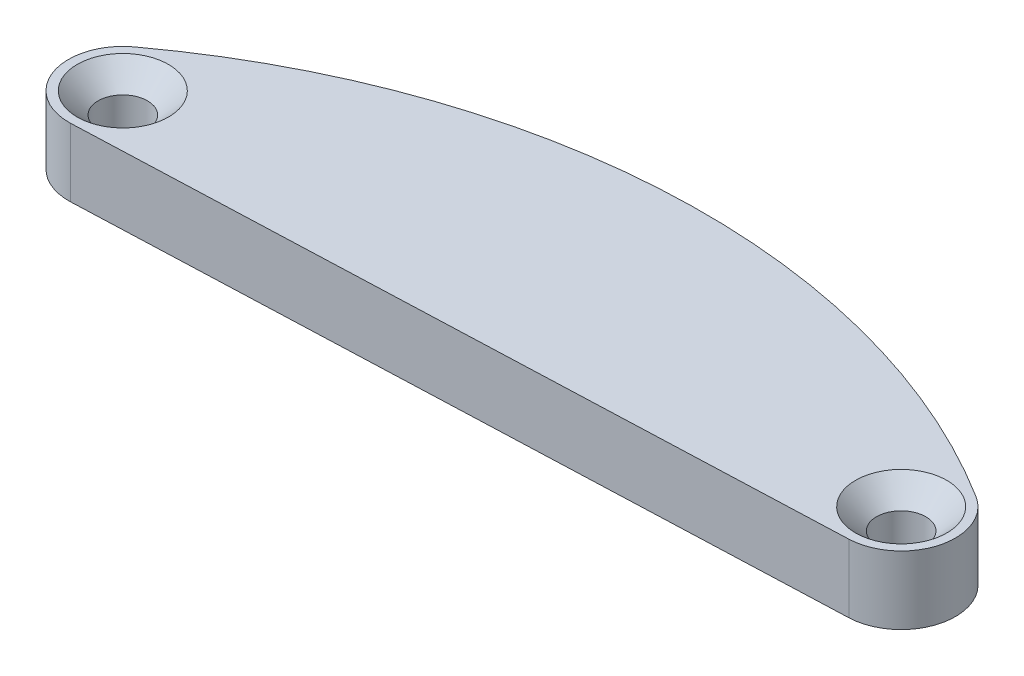
ISO-10303-21;
HEADER;
FILE_DESCRIPTION(('STEP AP214'),'2;1');
FILE_NAME('part.step','',(''),(''),'','','');
FILE_SCHEMA(('AUTOMOTIVE_DESIGN { 1 0 10303 214 1 1 1 1 }'));
ENDSEC;
DATA;
#1=APPLICATION_CONTEXT('core data for automotive mechanical design processes');
#2=APPLICATION_PROTOCOL_DEFINITION('international standard','automotive_design',2000,#1);
#3=PRODUCT_CONTEXT('',#1,'mechanical');
#4=PRODUCT('Part','Part','',(#3));
#5=PRODUCT_RELATED_PRODUCT_CATEGORY('part','',(#4));
#6=PRODUCT_DEFINITION_FORMATION('','',#4);
#7=PRODUCT_DEFINITION_CONTEXT('part definition',#1,'design');
#8=PRODUCT_DEFINITION('design','',#6,#7);
#9=PRODUCT_DEFINITION_SHAPE('','',#8);
#10=(LENGTH_UNIT() NAMED_UNIT(*) SI_UNIT(.MILLI.,.METRE.));
#11=(NAMED_UNIT(*) PLANE_ANGLE_UNIT() SI_UNIT($,.RADIAN.));
#12=(NAMED_UNIT(*) SI_UNIT($,.STERADIAN.) SOLID_ANGLE_UNIT());
#13=UNCERTAINTY_MEASURE_WITH_UNIT(LENGTH_MEASURE(1.E-05),#10,'distance_accuracy_value','');
#14=(GEOMETRIC_REPRESENTATION_CONTEXT(3) GLOBAL_UNCERTAINTY_ASSIGNED_CONTEXT((#13)) GLOBAL_UNIT_ASSIGNED_CONTEXT((#10,
#11,#12)) REPRESENTATION_CONTEXT('',''));
#15=CARTESIAN_POINT('',(0.,0.,0.));
#16=DIRECTION('',(0.,0.,1.));
#17=DIRECTION('',(1.,0.,0.));
#18=AXIS2_PLACEMENT_3D('',#15,#16,#17);
#19=CARTESIAN_POINT('',(-27.3313007374329,4.699,-37.));
#20=DIRECTION('',(0.,-1.,0.));
#21=DIRECTION('',(0.,0.,-1.));
#22=AXIS2_PLACEMENT_3D('',#19,#20,#21);
#23=CYLINDRICAL_SURFACE('',#22,3.75);
#24=CARTESIAN_POINT('',(-27.3313007374329,0.,-37.));
#25=DIRECTION('',(0.,1.,0.));
#26=DIRECTION('',(0.,0.,1.));
#27=AXIS2_PLACEMENT_3D('',#24,#25,#26);
#28=CIRCLE('',#27,3.75);
#29=CARTESIAN_POINT('',(-29.5593959062454,0.,-40.0163043478261));
#30=VERTEX_POINT('',#29);
#31=CARTESIAN_POINT('',(-27.18640840922,0.,-33.2528002170654));
#32=VERTEX_POINT('',#31);
#33=EDGE_CURVE('E96',#30,#32,#28,.T.);
#34=ORIENTED_EDGE('',*,*,#33,.T.);
#35=DIRECTION('',(0.,-1.,0.));
#36=VECTOR('',#35,1.);
#37=CARTESIAN_POINT('',(-27.18640840922,4.699,-33.2528002170654));
#38=LINE('',#37,#36);
#39=CARTESIAN_POINT('',(-27.18640840922,4.699,-33.2528002170654));
#40=VERTEX_POINT('',#39);
#41=EDGE_CURVE('E11',#40,#32,#38,.T.);
#42=ORIENTED_EDGE('',*,*,#41,.F.);
#43=CARTESIAN_POINT('',(-27.3313007374329,4.699,-37.));
#44=DIRECTION('',(0.,1.,0.));
#45=DIRECTION('',(0.,0.,1.));
#46=AXIS2_PLACEMENT_3D('',#43,#44,#45);
#47=CIRCLE('',#46,3.75);
#48=CARTESIAN_POINT('',(-29.5593959062454,4.699,-40.0163043478261));
#49=VERTEX_POINT('',#48);
#50=EDGE_CURVE('E84',#49,#40,#47,.T.);
#51=ORIENTED_EDGE('',*,*,#50,.F.);
#52=DIRECTION('',(0.,-1.,0.));
#53=VECTOR('',#52,1.);
#54=CARTESIAN_POINT('',(-29.5593959062454,4.699,-40.0163043478261));
#55=LINE('',#54,#53);
#56=EDGE_CURVE('E92',#49,#30,#55,.T.);
#57=ORIENTED_EDGE('',*,*,#56,.T.);
#58=EDGE_LOOP('',(#34,#42,#51,#57));
#59=FACE_BOUND('',#58,.T.);
#60=ADVANCED_FACE('F33',(#59),#23,.T.);
#61=CARTESIAN_POINT('',(-27.18640840922,4.699,-33.2528002170654));
#62=DIRECTION('',(-0.038637954190117,0.,-0.999253275449224));
#63=DIRECTION('',(-0.999253275449224,0.,0.038637954190117));
#64=AXIS2_PLACEMENT_3D('',#61,#62,#63);
#65=PLANE('',#64);
#66=DIRECTION('',(0.999253275449224,0.,-0.038637954190117));
#67=VECTOR('',#66,1.);
#68=CARTESIAN_POINT('',(-27.18640840922,0.,-33.2528002170654));
#69=LINE('',#68,#67);
#70=CARTESIAN_POINT('',(24.5375141635139,0.,-35.2528002170654));
#71=VERTEX_POINT('',#70);
#72=EDGE_CURVE('E88',#32,#71,#69,.T.);
#73=ORIENTED_EDGE('',*,*,#72,.T.);
#74=DIRECTION('',(0.,-1.,0.));
#75=VECTOR('',#74,1.);
#76=CARTESIAN_POINT('',(24.5375141635139,4.699,-35.2528002170654));
#77=LINE('',#76,#75);
#78=CARTESIAN_POINT('',(24.5375141635139,4.699,-35.2528002170654));
#79=VERTEX_POINT('',#78);
#80=EDGE_CURVE('E41',#79,#71,#77,.T.);
#81=ORIENTED_EDGE('',*,*,#80,.F.);
#82=DIRECTION('',(0.999253275449224,0.,-0.038637954190117));
#83=VECTOR('',#82,1.);
#84=CARTESIAN_POINT('',(-27.18640840922,4.699,-33.2528002170654));
#85=LINE('',#84,#83);
#86=EDGE_CURVE('E79',#40,#79,#85,.T.);
#87=ORIENTED_EDGE('',*,*,#86,.F.);
#88=ORIENTED_EDGE('',*,*,#41,.T.);
#89=EDGE_LOOP('',(#73,#81,#87,#88));
#90=FACE_BOUND('',#89,.T.);
#91=ADVANCED_FACE('F87',(#90),#65,.F.);
#92=CARTESIAN_POINT('',(24.3926218353009,4.699,-39.));
#93=DIRECTION('',(0.,-1.,0.));
#94=DIRECTION('',(0.,0.,-1.));
#95=AXIS2_PLACEMENT_3D('',#92,#93,#94);
#96=CYLINDRICAL_SURFACE('',#95,3.75);
#97=CARTESIAN_POINT('',(24.3926218353009,0.,-39.));
#98=DIRECTION('',(0.,1.,0.));
#99=DIRECTION('',(0.,0.,-1.));
#100=AXIS2_PLACEMENT_3D('',#97,#98,#99);
#101=CIRCLE('',#100,3.75);
#102=CARTESIAN_POINT('',(26.3811507892657,0.,-42.179347826087));
#103=VERTEX_POINT('',#102);
#104=EDGE_CURVE('E66',#71,#103,#101,.T.);
#105=ORIENTED_EDGE('',*,*,#104,.T.);
#106=DIRECTION('',(0.,-1.,0.));
#107=VECTOR('',#106,1.);
#108=CARTESIAN_POINT('',(26.3811507892657,4.699,-42.179347826087));
#109=LINE('',#108,#107);
#110=CARTESIAN_POINT('',(26.3811507892657,4.699,-42.179347826087));
#111=VERTEX_POINT('',#110);
#112=EDGE_CURVE('E89',#111,#103,#109,.T.);
#113=ORIENTED_EDGE('',*,*,#112,.F.);
#114=CARTESIAN_POINT('',(24.3926218353009,4.699,-39.));
#115=DIRECTION('',(0.,1.,0.));
#116=DIRECTION('',(0.,0.,-1.));
#117=AXIS2_PLACEMENT_3D('',#114,#115,#116);
#118=CIRCLE('',#117,3.75);
#119=EDGE_CURVE('E82',#79,#111,#118,.T.);
#120=ORIENTED_EDGE('',*,*,#119,.F.);
#121=ORIENTED_EDGE('',*,*,#80,.T.);
#122=EDGE_LOOP('',(#105,#113,#120,#121));
#123=FACE_BOUND('',#122,.T.);
#124=ADVANCED_FACE('F90',(#123),#96,.T.);
#125=CARTESIAN_POINT('',(0.,4.699,0.));
#126=DIRECTION('',(0.,-1.,0.));
#127=DIRECTION('',(0.,0.,-1.));
#128=AXIS2_PLACEMENT_3D('',#125,#126,#127);
#129=CYLINDRICAL_SURFACE('',#128,49.75);
#130=CARTESIAN_POINT('',(0.,0.,0.));
#131=DIRECTION('',(0.,1.,0.));
#132=DIRECTION('',(0.,0.,-1.));
#133=AXIS2_PLACEMENT_3D('',#130,#131,#132);
#134=CIRCLE('',#133,49.75);
#135=EDGE_CURVE('E72',#103,#30,#134,.T.);
#136=ORIENTED_EDGE('',*,*,#135,.T.);
#137=ORIENTED_EDGE('',*,*,#56,.F.);
#138=CARTESIAN_POINT('',(0.,4.699,0.));
#139=DIRECTION('',(0.,1.,0.));
#140=DIRECTION('',(0.,0.,-1.));
#141=AXIS2_PLACEMENT_3D('',#138,#139,#140);
#142=CIRCLE('',#141,49.75);
#143=EDGE_CURVE('E49',#111,#49,#142,.T.);
#144=ORIENTED_EDGE('',*,*,#143,.F.);
#145=ORIENTED_EDGE('',*,*,#112,.T.);
#146=EDGE_LOOP('',(#136,#137,#144,#145));
#147=FACE_BOUND('',#146,.T.);
#148=ADVANCED_FACE('F104',(#147),#129,.T.);
#149=CARTESIAN_POINT('',(-27.3313007374329,4.699,-37.));
#150=DIRECTION('',(0.,1.,0.));
#151=DIRECTION('',(0.,0.,1.));
#152=AXIS2_PLACEMENT_3D('',#149,#150,#151);
#153=PLANE('',#152);
#154=CARTESIAN_POINT('',(-27.3313007374329,4.699,-37.));
#155=DIRECTION('',(0.,1.,0.));
#156=DIRECTION('',(0.,0.,1.));
#157=AXIS2_PLACEMENT_3D('',#154,#155,#156);
#158=CIRCLE('',#157,3.15);
#159=CARTESIAN_POINT('',(-27.3313007374329,4.699,-33.85));
#160=VERTEX_POINT('',#159);
#161=EDGE_CURVE('E124',#160,#160,#158,.T.);
#162=ORIENTED_EDGE('',*,*,#161,.F.);
#163=EDGE_LOOP('',(#162));
#164=FACE_BOUND('',#163,.T.);
#165=CARTESIAN_POINT('',(24.3926218353009,4.699,-39.));
#166=DIRECTION('',(0.,1.,0.));
#167=DIRECTION('',(0.,0.,1.));
#168=AXIS2_PLACEMENT_3D('',#165,#166,#167);
#169=CIRCLE('',#168,3.15);
#170=CARTESIAN_POINT('',(24.3926218353009,4.699,-35.85));
#171=VERTEX_POINT('',#170);
#172=EDGE_CURVE('E115',#171,#171,#169,.T.);
#173=ORIENTED_EDGE('',*,*,#172,.F.);
#174=EDGE_LOOP('',(#173));
#175=FACE_BOUND('',#174,.T.);
#176=ORIENTED_EDGE('',*,*,#50,.T.);
#177=ORIENTED_EDGE('',*,*,#86,.T.);
#178=ORIENTED_EDGE('',*,*,#119,.T.);
#179=ORIENTED_EDGE('',*,*,#143,.T.);
#180=EDGE_LOOP('',(#176,#177,#178,#179));
#181=FACE_BOUND('',#180,.T.);
#182=ADVANCED_FACE('F80',(#164,#175,#181),#153,.T.);
#183=CARTESIAN_POINT('',(-27.3313007374329,0.,-37.));
#184=DIRECTION('',(0.,1.,0.));
#185=DIRECTION('',(0.,0.,1.));
#186=AXIS2_PLACEMENT_3D('',#183,#184,#185);
#187=PLANE('',#186);
#188=CARTESIAN_POINT('',(-27.3313007374329,0.,-37.));
#189=DIRECTION('',(0.,1.,0.));
#190=DIRECTION('',(0.,0.,1.));
#191=AXIS2_PLACEMENT_3D('',#188,#189,#190);
#192=CIRCLE('',#191,1.7);
#193=CARTESIAN_POINT('',(-27.3313007374329,0.,-35.3));
#194=VERTEX_POINT('',#193);
#195=EDGE_CURVE('E118',#194,#194,#192,.T.);
#196=ORIENTED_EDGE('',*,*,#195,.T.);
#197=EDGE_LOOP('',(#196));
#198=FACE_BOUND('',#197,.T.);
#199=CARTESIAN_POINT('',(24.3926218353009,0.,-39.));
#200=DIRECTION('',(0.,1.,0.));
#201=DIRECTION('',(0.,0.,1.));
#202=AXIS2_PLACEMENT_3D('',#199,#200,#201);
#203=CIRCLE('',#202,1.7);
#204=CARTESIAN_POINT('',(24.3926218353009,0.,-37.3));
#205=VERTEX_POINT('',#204);
#206=EDGE_CURVE('E99',#205,#205,#203,.T.);
#207=ORIENTED_EDGE('',*,*,#206,.T.);
#208=EDGE_LOOP('',(#207));
#209=FACE_BOUND('',#208,.T.);
#210=ORIENTED_EDGE('',*,*,#33,.F.);
#211=ORIENTED_EDGE('',*,*,#135,.F.);
#212=ORIENTED_EDGE('',*,*,#104,.F.);
#213=ORIENTED_EDGE('',*,*,#72,.F.);
#214=EDGE_LOOP('',(#210,#211,#212,#213));
#215=FACE_BOUND('',#214,.T.);
#216=ADVANCED_FACE('F107',(#198,#209,#215),#187,.F.);
#217=CARTESIAN_POINT('',(24.3926218353009,4.699,-39.));
#218=DIRECTION('',(0.,1.,0.));
#219=DIRECTION('',(0.,0.,1.));
#220=AXIS2_PLACEMENT_3D('',#217,#218,#219);
#221=CYLINDRICAL_SURFACE('',#220,1.7);
#222=ORIENTED_EDGE('',*,*,#206,.F.);
#223=EDGE_LOOP('',(#222));
#224=FACE_BOUND('',#223,.T.);
#225=CARTESIAN_POINT('',(24.3926218353009,3.249,-39.));
#226=DIRECTION('',(0.,1.,0.));
#227=DIRECTION('',(0.,0.,1.));
#228=AXIS2_PLACEMENT_3D('',#225,#226,#227);
#229=CIRCLE('',#228,1.7);
#230=CARTESIAN_POINT('',(24.3926218353009,3.249,-37.3));
#231=VERTEX_POINT('',#230);
#232=EDGE_CURVE('E112',#231,#231,#229,.T.);
#233=ORIENTED_EDGE('',*,*,#232,.T.);
#234=EDGE_LOOP('',(#233));
#235=FACE_BOUND('',#234,.T.);
#236=ADVANCED_FACE('F138',(#224,#235),#221,.F.);
#237=CARTESIAN_POINT('',(24.3926218353009,4.699,-39.));
#238=DIRECTION('',(0.,1.,0.));
#239=DIRECTION('',(0.,0.,1.));
#240=AXIS2_PLACEMENT_3D('',#237,#238,#239);
#241=CONICAL_SURFACE('',#240,3.15,0.785398163397448);
#242=ORIENTED_EDGE('',*,*,#232,.F.);
#243=EDGE_LOOP('',(#242));
#244=FACE_BOUND('',#243,.T.);
#245=ORIENTED_EDGE('',*,*,#172,.T.);
#246=EDGE_LOOP('',(#245));
#247=FACE_BOUND('',#246,.T.);
#248=ADVANCED_FACE('F135',(#244,#247),#241,.F.);
#249=CARTESIAN_POINT('',(-27.3313007374329,4.699,-37.));
#250=DIRECTION('',(0.,1.,0.));
#251=DIRECTION('',(0.,0.,1.));
#252=AXIS2_PLACEMENT_3D('',#249,#250,#251);
#253=CYLINDRICAL_SURFACE('',#252,1.7);
#254=ORIENTED_EDGE('',*,*,#195,.F.);
#255=EDGE_LOOP('',(#254));
#256=FACE_BOUND('',#255,.T.);
#257=CARTESIAN_POINT('',(-27.3313007374329,3.249,-37.));
#258=DIRECTION('',(0.,1.,0.));
#259=DIRECTION('',(0.,0.,1.));
#260=AXIS2_PLACEMENT_3D('',#257,#258,#259);
#261=CIRCLE('',#260,1.7);
#262=CARTESIAN_POINT('',(-27.3313007374329,3.249,-35.3));
#263=VERTEX_POINT('',#262);
#264=EDGE_CURVE('E121',#263,#263,#261,.T.);
#265=ORIENTED_EDGE('',*,*,#264,.T.);
#266=EDGE_LOOP('',(#265));
#267=FACE_BOUND('',#266,.T.);
#268=ADVANCED_FACE('F137',(#256,#267),#253,.F.);
#269=CARTESIAN_POINT('',(-27.3313007374329,4.699,-37.));
#270=DIRECTION('',(0.,1.,0.));
#271=DIRECTION('',(0.,0.,1.));
#272=AXIS2_PLACEMENT_3D('',#269,#270,#271);
#273=CONICAL_SURFACE('',#272,3.15,0.785398163397448);
#274=ORIENTED_EDGE('',*,*,#264,.F.);
#275=EDGE_LOOP('',(#274));
#276=FACE_BOUND('',#275,.T.);
#277=ORIENTED_EDGE('',*,*,#161,.T.);
#278=EDGE_LOOP('',(#277));
#279=FACE_BOUND('',#278,.T.);
#280=ADVANCED_FACE('F128',(#276,#279),#273,.F.);
#281=CLOSED_SHELL('',(#60,#91,#124,#148,#182,#216,#236,#248,#268,#280));
#282=MANIFOLD_SOLID_BREP('B2',#281);
#283=ADVANCED_BREP_SHAPE_REPRESENTATION('',(#18,#282),#14);
#284=SHAPE_DEFINITION_REPRESENTATION(#9,#283);
ENDSEC;
END-ISO-10303-21;
